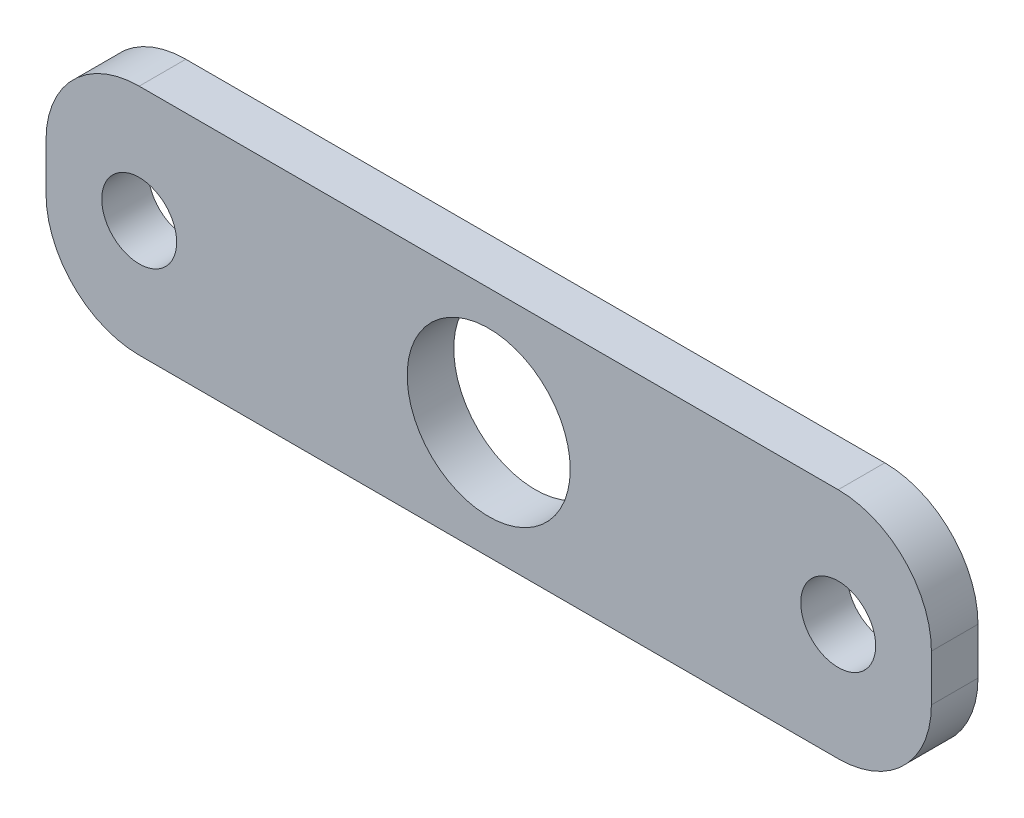
ISO-10303-21;
HEADER;
FILE_DESCRIPTION(('STEP AP214'),'2;1');
FILE_NAME('part.step','',(''),(''),'','','');
FILE_SCHEMA(('AUTOMOTIVE_DESIGN { 1 0 10303 214 1 1 1 1 }'));
ENDSEC;
DATA;
#1=APPLICATION_CONTEXT('core data for automotive mechanical design processes');
#2=APPLICATION_PROTOCOL_DEFINITION('international standard','automotive_design',2000,#1);
#3=PRODUCT_CONTEXT('',#1,'mechanical');
#4=PRODUCT('Part','Part','',(#3));
#5=PRODUCT_RELATED_PRODUCT_CATEGORY('part','',(#4));
#6=PRODUCT_DEFINITION_FORMATION('','',#4);
#7=PRODUCT_DEFINITION_CONTEXT('part definition',#1,'design');
#8=PRODUCT_DEFINITION('design','',#6,#7);
#9=PRODUCT_DEFINITION_SHAPE('','',#8);
#10=(LENGTH_UNIT() NAMED_UNIT(*) SI_UNIT(.MILLI.,.METRE.));
#11=(NAMED_UNIT(*) PLANE_ANGLE_UNIT() SI_UNIT($,.RADIAN.));
#12=(NAMED_UNIT(*) SI_UNIT($,.STERADIAN.) SOLID_ANGLE_UNIT());
#13=UNCERTAINTY_MEASURE_WITH_UNIT(LENGTH_MEASURE(1.E-05),#10,'distance_accuracy_value','');
#14=(GEOMETRIC_REPRESENTATION_CONTEXT(3) GLOBAL_UNCERTAINTY_ASSIGNED_CONTEXT((#13)) GLOBAL_UNIT_ASSIGNED_CONTEXT((#10,
#11,#12)) REPRESENTATION_CONTEXT('',''));
#15=CARTESIAN_POINT('',(0.,0.,0.));
#16=DIRECTION('',(0.,0.,1.));
#17=DIRECTION('',(1.,0.,0.));
#18=AXIS2_PLACEMENT_3D('',#15,#16,#17);
#19=CARTESIAN_POINT('',(30.1625,0.,1.5875));
#20=DIRECTION('',(1.,0.,0.));
#21=DIRECTION('',(0.,0.,-1.));
#22=AXIS2_PLACEMENT_3D('',#19,#20,#21);
#23=PLANE('',#22);
#24=DIRECTION('',(0.,-1.,0.));
#25=VECTOR('',#24,1.);
#26=CARTESIAN_POINT('',(30.1625,0.,1.5875));
#27=LINE('',#26,#25);
#28=CARTESIAN_POINT('',(30.1625,1.5875,1.5875));
#29=VERTEX_POINT('',#28);
#30=CARTESIAN_POINT('',(30.1625,-1.5875,1.5875));
#31=VERTEX_POINT('',#30);
#32=EDGE_CURVE('E165',#29,#31,#27,.T.);
#33=ORIENTED_EDGE('',*,*,#32,.T.);
#34=DIRECTION('',(0.,0.,-1.));
#35=VECTOR('',#34,1.);
#36=CARTESIAN_POINT('',(30.1625,-1.5875,-1.5875));
#37=LINE('',#36,#35);
#38=CARTESIAN_POINT('',(30.1625,-1.5875,-1.5875));
#39=VERTEX_POINT('',#38);
#40=EDGE_CURVE('E121',#31,#39,#37,.T.);
#41=ORIENTED_EDGE('',*,*,#40,.T.);
#42=DIRECTION('',(0.,-1.,0.));
#43=VECTOR('',#42,1.);
#44=CARTESIAN_POINT('',(30.1625,0.,-1.5875));
#45=LINE('',#44,#43);
#46=CARTESIAN_POINT('',(30.1625,1.5875,-1.5875));
#47=VERTEX_POINT('',#46);
#48=EDGE_CURVE('E106',#47,#39,#45,.T.);
#49=ORIENTED_EDGE('',*,*,#48,.F.);
#50=DIRECTION('',(0.,0.,-1.));
#51=VECTOR('',#50,1.);
#52=CARTESIAN_POINT('',(30.1625,1.5875,1.5875));
#53=LINE('',#52,#51);
#54=EDGE_CURVE('E118',#47,#29,#53,.F.);
#55=ORIENTED_EDGE('',*,*,#54,.T.);
#56=EDGE_LOOP('',(#33,#41,#49,#55));
#57=FACE_BOUND('',#56,.T.);
#58=ADVANCED_FACE('F35',(#57),#23,.T.);
#59=CARTESIAN_POINT('',(0.,7.9375,1.5875));
#60=DIRECTION('',(0.,1.,0.));
#61=DIRECTION('',(0.,0.,1.));
#62=AXIS2_PLACEMENT_3D('',#59,#60,#61);
#63=PLANE('',#62);
#64=DIRECTION('',(1.,0.,0.));
#65=VECTOR('',#64,1.);
#66=CARTESIAN_POINT('',(0.,7.9375,1.5875));
#67=LINE('',#66,#65);
#68=CARTESIAN_POINT('',(-23.8125,7.9375,1.5875));
#69=VERTEX_POINT('',#68);
#70=CARTESIAN_POINT('',(23.8125,7.9375,1.5875));
#71=VERTEX_POINT('',#70);
#72=EDGE_CURVE('E159',#69,#71,#67,.T.);
#73=ORIENTED_EDGE('',*,*,#72,.T.);
#74=DIRECTION('',(0.,0.,-1.));
#75=VECTOR('',#74,1.);
#76=CARTESIAN_POINT('',(23.8125,7.9375,1.5875));
#77=LINE('',#76,#75);
#78=CARTESIAN_POINT('',(23.8125,7.9375,-1.5875));
#79=VERTEX_POINT('',#78);
#80=EDGE_CURVE('E11',#71,#79,#77,.T.);
#81=ORIENTED_EDGE('',*,*,#80,.T.);
#82=DIRECTION('',(1.,0.,0.));
#83=VECTOR('',#82,1.);
#84=CARTESIAN_POINT('',(0.,7.9375,-1.5875));
#85=LINE('',#84,#83);
#86=CARTESIAN_POINT('',(-23.8125,7.9375,-1.5875));
#87=VERTEX_POINT('',#86);
#88=EDGE_CURVE('E108',#87,#79,#85,.T.);
#89=ORIENTED_EDGE('',*,*,#88,.F.);
#90=DIRECTION('',(0.,0.,-1.));
#91=VECTOR('',#90,1.);
#92=CARTESIAN_POINT('',(-23.8125,7.9375,1.5875));
#93=LINE('',#92,#91);
#94=EDGE_CURVE('E43',#87,#69,#93,.F.);
#95=ORIENTED_EDGE('',*,*,#94,.T.);
#96=EDGE_LOOP('',(#73,#81,#89,#95));
#97=FACE_BOUND('',#96,.T.);
#98=ADVANCED_FACE('F158',(#97),#63,.T.);
#99=CARTESIAN_POINT('',(-30.1625,0.,1.5875));
#100=DIRECTION('',(1.,0.,0.));
#101=DIRECTION('',(0.,0.,-1.));
#102=AXIS2_PLACEMENT_3D('',#99,#100,#101);
#103=PLANE('',#102);
#104=DIRECTION('',(0.,-1.,0.));
#105=VECTOR('',#104,1.);
#106=CARTESIAN_POINT('',(-30.1625,0.,-1.5875));
#107=LINE('',#106,#105);
#108=CARTESIAN_POINT('',(-30.1625,1.5875,-1.5875));
#109=VERTEX_POINT('',#108);
#110=CARTESIAN_POINT('',(-30.1625,-1.5875,-1.5875));
#111=VERTEX_POINT('',#110);
#112=EDGE_CURVE('E170',#109,#111,#107,.T.);
#113=ORIENTED_EDGE('',*,*,#112,.T.);
#114=DIRECTION('',(0.,0.,-1.));
#115=VECTOR('',#114,1.);
#116=CARTESIAN_POINT('',(-30.1625,-1.5875,1.5875));
#117=LINE('',#116,#115);
#118=CARTESIAN_POINT('',(-30.1625,-1.5875,1.5875));
#119=VERTEX_POINT('',#118);
#120=EDGE_CURVE('E50',#111,#119,#117,.F.);
#121=ORIENTED_EDGE('',*,*,#120,.T.);
#122=DIRECTION('',(0.,-1.,0.));
#123=VECTOR('',#122,1.);
#124=CARTESIAN_POINT('',(-30.1625,0.,1.5875));
#125=LINE('',#124,#123);
#126=CARTESIAN_POINT('',(-30.1625,1.5875,1.5875));
#127=VERTEX_POINT('',#126);
#128=EDGE_CURVE('E164',#127,#119,#125,.T.);
#129=ORIENTED_EDGE('',*,*,#128,.F.);
#130=DIRECTION('',(0.,0.,-1.));
#131=VECTOR('',#130,1.);
#132=CARTESIAN_POINT('',(-30.1625,1.5875,-1.5875));
#133=LINE('',#132,#131);
#134=EDGE_CURVE('E152',#127,#109,#133,.T.);
#135=ORIENTED_EDGE('',*,*,#134,.T.);
#136=EDGE_LOOP('',(#113,#121,#129,#135));
#137=FACE_BOUND('',#136,.T.);
#138=ADVANCED_FACE('F169',(#137),#103,.F.);
#139=CARTESIAN_POINT('',(-23.8125,0.,1.5875));
#140=DIRECTION('',(0.,0.,-1.));
#141=DIRECTION('',(-1.,0.,0.));
#142=AXIS2_PLACEMENT_3D('',#139,#140,#141);
#143=CYLINDRICAL_SURFACE('',#142,2.5527);
#144=CARTESIAN_POINT('',(-23.8125,0.,1.5875));
#145=DIRECTION('',(0.,0.,1.));
#146=DIRECTION('',(1.,0.,0.));
#147=AXIS2_PLACEMENT_3D('',#144,#145,#146);
#148=CIRCLE('',#147,2.5527);
#149=CARTESIAN_POINT('',(-21.2598,0.,1.5875));
#150=VERTEX_POINT('',#149);
#151=EDGE_CURVE('E131',#150,#150,#148,.T.);
#152=ORIENTED_EDGE('',*,*,#151,.T.);
#153=EDGE_LOOP('',(#152));
#154=FACE_BOUND('',#153,.T.);
#155=CARTESIAN_POINT('',(-23.8125,0.,-1.5875));
#156=DIRECTION('',(0.,0.,1.));
#157=DIRECTION('',(1.,0.,0.));
#158=AXIS2_PLACEMENT_3D('',#155,#156,#157);
#159=CIRCLE('',#158,2.5527);
#160=CARTESIAN_POINT('',(-21.2598,0.,-1.5875));
#161=VERTEX_POINT('',#160);
#162=EDGE_CURVE('E175',#161,#161,#159,.T.);
#163=ORIENTED_EDGE('',*,*,#162,.F.);
#164=EDGE_LOOP('',(#163));
#165=FACE_BOUND('',#164,.T.);
#166=ADVANCED_FACE('F210',(#154,#165),#143,.F.);
#167=CARTESIAN_POINT('',(0.,-7.9375,1.5875));
#168=DIRECTION('',(0.,1.,0.));
#169=DIRECTION('',(0.,0.,1.));
#170=AXIS2_PLACEMENT_3D('',#167,#168,#169);
#171=PLANE('',#170);
#172=DIRECTION('',(1.,0.,0.));
#173=VECTOR('',#172,1.);
#174=CARTESIAN_POINT('',(0.,-7.9375,-1.5875));
#175=LINE('',#174,#173);
#176=CARTESIAN_POINT('',(-23.8125,-7.9375,-1.5875));
#177=VERTEX_POINT('',#176);
#178=CARTESIAN_POINT('',(23.8125,-7.9375,-1.5875));
#179=VERTEX_POINT('',#178);
#180=EDGE_CURVE('E172',#177,#179,#175,.T.);
#181=ORIENTED_EDGE('',*,*,#180,.T.);
#182=DIRECTION('',(0.,0.,-1.));
#183=VECTOR('',#182,1.);
#184=CARTESIAN_POINT('',(23.8125,-7.9375,1.5875));
#185=LINE('',#184,#183);
#186=CARTESIAN_POINT('',(23.8125,-7.9375,1.5875));
#187=VERTEX_POINT('',#186);
#188=EDGE_CURVE('E144',#179,#187,#185,.F.);
#189=ORIENTED_EDGE('',*,*,#188,.T.);
#190=DIRECTION('',(1.,0.,0.));
#191=VECTOR('',#190,1.);
#192=CARTESIAN_POINT('',(0.,-7.9375,1.5875));
#193=LINE('',#192,#191);
#194=CARTESIAN_POINT('',(-23.8125,-7.9375,1.5875));
#195=VERTEX_POINT('',#194);
#196=EDGE_CURVE('E191',#195,#187,#193,.T.);
#197=ORIENTED_EDGE('',*,*,#196,.F.);
#198=DIRECTION('',(0.,0.,-1.));
#199=VECTOR('',#198,1.);
#200=CARTESIAN_POINT('',(-23.8125,-7.9375,1.5875));
#201=LINE('',#200,#199);
#202=EDGE_CURVE('E141',#195,#177,#201,.T.);
#203=ORIENTED_EDGE('',*,*,#202,.T.);
#204=EDGE_LOOP('',(#181,#189,#197,#203));
#205=FACE_BOUND('',#204,.T.);
#206=ADVANCED_FACE('F202',(#205),#171,.F.);
#207=CARTESIAN_POINT('',(0.,0.,1.5875));
#208=DIRECTION('',(0.,0.,-1.));
#209=DIRECTION('',(-1.,0.,0.));
#210=AXIS2_PLACEMENT_3D('',#207,#208,#209);
#211=CYLINDRICAL_SURFACE('',#210,5.55625);
#212=CARTESIAN_POINT('',(0.,0.,1.5875));
#213=DIRECTION('',(0.,0.,1.));
#214=DIRECTION('',(1.,0.,0.));
#215=AXIS2_PLACEMENT_3D('',#212,#213,#214);
#216=CIRCLE('',#215,5.55625);
#217=CARTESIAN_POINT('',(5.55625,0.,1.5875));
#218=VERTEX_POINT('',#217);
#219=EDGE_CURVE('E181',#218,#218,#216,.T.);
#220=ORIENTED_EDGE('',*,*,#219,.T.);
#221=EDGE_LOOP('',(#220));
#222=FACE_BOUND('',#221,.T.);
#223=CARTESIAN_POINT('',(0.,0.,-1.5875));
#224=DIRECTION('',(0.,0.,1.));
#225=DIRECTION('',(1.,0.,0.));
#226=AXIS2_PLACEMENT_3D('',#223,#224,#225);
#227=CIRCLE('',#226,5.55625);
#228=CARTESIAN_POINT('',(5.55625,0.,-1.5875));
#229=VERTEX_POINT('',#228);
#230=EDGE_CURVE('E122',#229,#229,#227,.T.);
#231=ORIENTED_EDGE('',*,*,#230,.F.);
#232=EDGE_LOOP('',(#231));
#233=FACE_BOUND('',#232,.T.);
#234=ADVANCED_FACE('F199',(#222,#233),#211,.F.);
#235=CARTESIAN_POINT('',(23.8125,0.,1.5875));
#236=DIRECTION('',(0.,0.,-1.));
#237=DIRECTION('',(-1.,0.,0.));
#238=AXIS2_PLACEMENT_3D('',#235,#236,#237);
#239=CYLINDRICAL_SURFACE('',#238,2.5527);
#240=CARTESIAN_POINT('',(23.8125,0.,1.5875));
#241=DIRECTION('',(0.,0.,1.));
#242=DIRECTION('',(1.,0.,0.));
#243=AXIS2_PLACEMENT_3D('',#240,#241,#242);
#244=CIRCLE('',#243,2.5527);
#245=CARTESIAN_POINT('',(26.3652,0.,1.5875));
#246=VERTEX_POINT('',#245);
#247=EDGE_CURVE('E127',#246,#246,#244,.T.);
#248=ORIENTED_EDGE('',*,*,#247,.T.);
#249=EDGE_LOOP('',(#248));
#250=FACE_BOUND('',#249,.T.);
#251=CARTESIAN_POINT('',(23.8125,0.,-1.5875));
#252=DIRECTION('',(0.,0.,1.));
#253=DIRECTION('',(1.,0.,0.));
#254=AXIS2_PLACEMENT_3D('',#251,#252,#253);
#255=CIRCLE('',#254,2.5527);
#256=CARTESIAN_POINT('',(26.3652,0.,-1.5875));
#257=VERTEX_POINT('',#256);
#258=EDGE_CURVE('E134',#257,#257,#255,.T.);
#259=ORIENTED_EDGE('',*,*,#258,.F.);
#260=EDGE_LOOP('',(#259));
#261=FACE_BOUND('',#260,.T.);
#262=ADVANCED_FACE('F201',(#250,#261),#239,.F.);
#263=CARTESIAN_POINT('',(0.,0.,1.5875));
#264=DIRECTION('',(0.,0.,1.));
#265=DIRECTION('',(1.,0.,0.));
#266=AXIS2_PLACEMENT_3D('',#263,#264,#265);
#267=PLANE('',#266);
#268=ORIENTED_EDGE('',*,*,#219,.F.);
#269=EDGE_LOOP('',(#268));
#270=FACE_BOUND('',#269,.T.);
#271=ORIENTED_EDGE('',*,*,#196,.T.);
#272=CARTESIAN_POINT('',(23.8125,-1.5875,1.5875));
#273=DIRECTION('',(0.,0.,1.));
#274=DIRECTION('',(1.,0.,0.));
#275=AXIS2_PLACEMENT_3D('',#272,#273,#274);
#276=CIRCLE('',#275,6.35);
#277=EDGE_CURVE('E150',#187,#31,#276,.T.);
#278=ORIENTED_EDGE('',*,*,#277,.T.);
#279=ORIENTED_EDGE('',*,*,#32,.F.);
#280=CARTESIAN_POINT('',(23.8125,1.5875,1.5875));
#281=DIRECTION('',(0.,0.,1.));
#282=DIRECTION('',(1.,0.,0.));
#283=AXIS2_PLACEMENT_3D('',#280,#281,#282);
#284=CIRCLE('',#283,6.35);
#285=EDGE_CURVE('E126',#29,#71,#284,.T.);
#286=ORIENTED_EDGE('',*,*,#285,.T.);
#287=ORIENTED_EDGE('',*,*,#72,.F.);
#288=CARTESIAN_POINT('',(-23.8125,1.5875,1.5875));
#289=DIRECTION('',(0.,0.,1.));
#290=DIRECTION('',(1.,0.,0.));
#291=AXIS2_PLACEMENT_3D('',#288,#289,#290);
#292=CIRCLE('',#291,6.35);
#293=EDGE_CURVE('E57',#69,#127,#292,.T.);
#294=ORIENTED_EDGE('',*,*,#293,.T.);
#295=ORIENTED_EDGE('',*,*,#128,.T.);
#296=CARTESIAN_POINT('',(-23.8125,-1.5875,1.5875));
#297=DIRECTION('',(0.,0.,1.));
#298=DIRECTION('',(1.,0.,0.));
#299=AXIS2_PLACEMENT_3D('',#296,#297,#298);
#300=CIRCLE('',#299,6.35);
#301=EDGE_CURVE('E148',#119,#195,#300,.T.);
#302=ORIENTED_EDGE('',*,*,#301,.T.);
#303=EDGE_LOOP('',(#271,#278,#279,#286,#287,#294,#295,#302));
#304=FACE_BOUND('',#303,.T.);
#305=ORIENTED_EDGE('',*,*,#151,.F.);
#306=EDGE_LOOP('',(#305));
#307=FACE_BOUND('',#306,.T.);
#308=ORIENTED_EDGE('',*,*,#247,.F.);
#309=EDGE_LOOP('',(#308));
#310=FACE_BOUND('',#309,.T.);
#311=ADVANCED_FACE('F162',(#270,#304,#307,#310),#267,.T.);
#312=CARTESIAN_POINT('',(0.,0.,-1.5875));
#313=DIRECTION('',(0.,0.,1.));
#314=DIRECTION('',(1.,0.,0.));
#315=AXIS2_PLACEMENT_3D('',#312,#313,#314);
#316=PLANE('',#315);
#317=ORIENTED_EDGE('',*,*,#230,.T.);
#318=EDGE_LOOP('',(#317));
#319=FACE_BOUND('',#318,.T.);
#320=ORIENTED_EDGE('',*,*,#48,.T.);
#321=CARTESIAN_POINT('',(23.8125,-1.5875,-1.5875));
#322=DIRECTION('',(0.,0.,1.));
#323=DIRECTION('',(1.,0.,0.));
#324=AXIS2_PLACEMENT_3D('',#321,#322,#323);
#325=CIRCLE('',#324,6.35);
#326=EDGE_CURVE('E139',#39,#179,#325,.F.);
#327=ORIENTED_EDGE('',*,*,#326,.T.);
#328=ORIENTED_EDGE('',*,*,#180,.F.);
#329=CARTESIAN_POINT('',(-23.8125,-1.5875,-1.5875));
#330=DIRECTION('',(0.,0.,1.));
#331=DIRECTION('',(1.,0.,0.));
#332=AXIS2_PLACEMENT_3D('',#329,#330,#331);
#333=CIRCLE('',#332,6.35);
#334=EDGE_CURVE('E112',#177,#111,#333,.F.);
#335=ORIENTED_EDGE('',*,*,#334,.T.);
#336=ORIENTED_EDGE('',*,*,#112,.F.);
#337=CARTESIAN_POINT('',(-23.8125,1.5875,-1.5875));
#338=DIRECTION('',(0.,0.,1.));
#339=DIRECTION('',(1.,0.,0.));
#340=AXIS2_PLACEMENT_3D('',#337,#338,#339);
#341=CIRCLE('',#340,6.35);
#342=EDGE_CURVE('E113',#109,#87,#341,.F.);
#343=ORIENTED_EDGE('',*,*,#342,.T.);
#344=ORIENTED_EDGE('',*,*,#88,.T.);
#345=CARTESIAN_POINT('',(23.8125,1.5875,-1.5875));
#346=DIRECTION('',(0.,0.,1.));
#347=DIRECTION('',(1.,0.,0.));
#348=AXIS2_PLACEMENT_3D('',#345,#346,#347);
#349=CIRCLE('',#348,6.35);
#350=EDGE_CURVE('E102',#79,#47,#349,.F.);
#351=ORIENTED_EDGE('',*,*,#350,.T.);
#352=EDGE_LOOP('',(#320,#327,#328,#335,#336,#343,#344,#351));
#353=FACE_BOUND('',#352,.T.);
#354=ORIENTED_EDGE('',*,*,#162,.T.);
#355=EDGE_LOOP('',(#354));
#356=FACE_BOUND('',#355,.T.);
#357=ORIENTED_EDGE('',*,*,#258,.T.);
#358=EDGE_LOOP('',(#357));
#359=FACE_BOUND('',#358,.T.);
#360=ADVANCED_FACE('F104',(#319,#353,#356,#359),#316,.F.);
#361=CARTESIAN_POINT('',(23.8125,-1.5875,1.5875));
#362=DIRECTION('',(0.,0.,1.));
#363=DIRECTION('',(1.,0.,0.));
#364=AXIS2_PLACEMENT_3D('',#361,#362,#363);
#365=CYLINDRICAL_SURFACE('',#364,6.35);
#366=ORIENTED_EDGE('',*,*,#277,.F.);
#367=ORIENTED_EDGE('',*,*,#188,.F.);
#368=ORIENTED_EDGE('',*,*,#326,.F.);
#369=ORIENTED_EDGE('',*,*,#40,.F.);
#370=EDGE_LOOP('',(#366,#367,#368,#369));
#371=FACE_BOUND('',#370,.T.);
#372=ADVANCED_FACE('F228',(#371),#365,.T.);
#373=CARTESIAN_POINT('',(-23.8125,-1.5875,1.5875));
#374=DIRECTION('',(0.,0.,-1.));
#375=DIRECTION('',(-1.,0.,0.));
#376=AXIS2_PLACEMENT_3D('',#373,#374,#375);
#377=CYLINDRICAL_SURFACE('',#376,6.35);
#378=ORIENTED_EDGE('',*,*,#301,.F.);
#379=ORIENTED_EDGE('',*,*,#120,.F.);
#380=ORIENTED_EDGE('',*,*,#334,.F.);
#381=ORIENTED_EDGE('',*,*,#202,.F.);
#382=EDGE_LOOP('',(#378,#379,#380,#381));
#383=FACE_BOUND('',#382,.T.);
#384=ADVANCED_FACE('F246',(#383),#377,.T.);
#385=CARTESIAN_POINT('',(23.8125,1.5875,1.5875));
#386=DIRECTION('',(0.,0.,-1.));
#387=DIRECTION('',(-1.,0.,0.));
#388=AXIS2_PLACEMENT_3D('',#385,#386,#387);
#389=CYLINDRICAL_SURFACE('',#388,6.35);
#390=ORIENTED_EDGE('',*,*,#285,.F.);
#391=ORIENTED_EDGE('',*,*,#54,.F.);
#392=ORIENTED_EDGE('',*,*,#350,.F.);
#393=ORIENTED_EDGE('',*,*,#80,.F.);
#394=EDGE_LOOP('',(#390,#391,#392,#393));
#395=FACE_BOUND('',#394,.T.);
#396=ADVANCED_FACE('F125',(#395),#389,.T.);
#397=CARTESIAN_POINT('',(-23.8125,1.5875,1.5875));
#398=DIRECTION('',(0.,0.,1.));
#399=DIRECTION('',(1.,0.,0.));
#400=AXIS2_PLACEMENT_3D('',#397,#398,#399);
#401=CYLINDRICAL_SURFACE('',#400,6.35);
#402=ORIENTED_EDGE('',*,*,#293,.F.);
#403=ORIENTED_EDGE('',*,*,#94,.F.);
#404=ORIENTED_EDGE('',*,*,#342,.F.);
#405=ORIENTED_EDGE('',*,*,#134,.F.);
#406=EDGE_LOOP('',(#402,#403,#404,#405));
#407=FACE_BOUND('',#406,.T.);
#408=ADVANCED_FACE('F37',(#407),#401,.T.);
#409=CLOSED_SHELL('',(#58,#98,#138,#166,#206,#234,#262,#311,#360,#372,#384,#396,#408));
#410=MANIFOLD_SOLID_BREP('B2',#409);
#411=ADVANCED_BREP_SHAPE_REPRESENTATION('',(#18,#410),#14);
#412=SHAPE_DEFINITION_REPRESENTATION(#9,#411);
ENDSEC;
END-ISO-10303-21;
